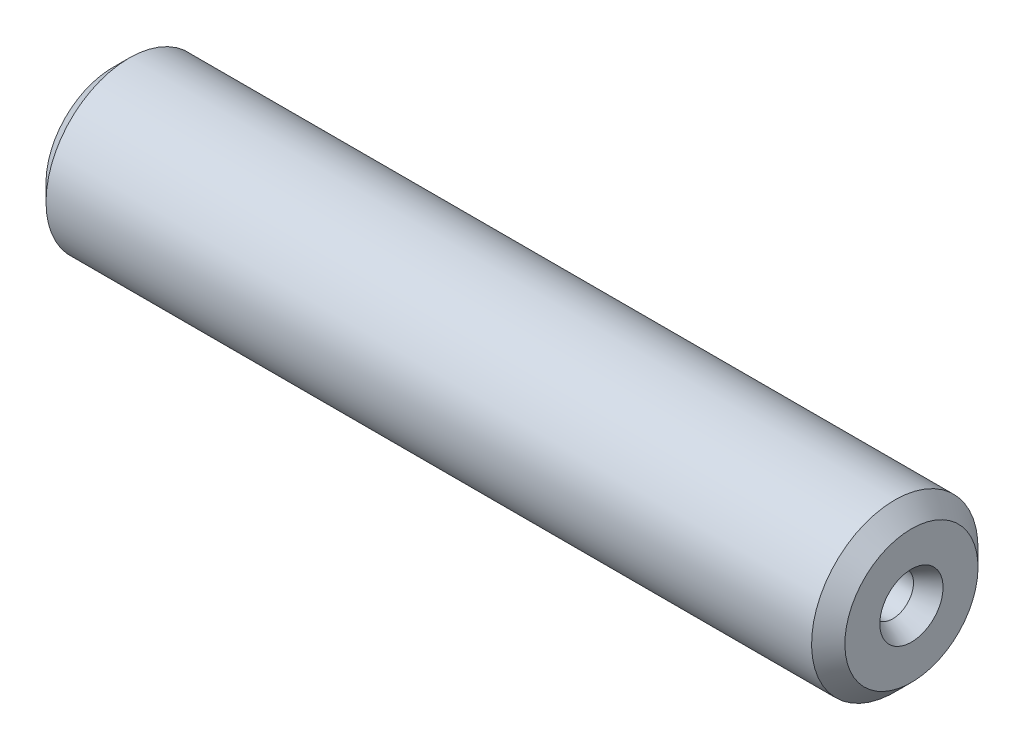
ISO-10303-21;
HEADER;
FILE_DESCRIPTION(('STEP AP214'),'2;1');
FILE_NAME('part.step','',(''),(''),'','','');
FILE_SCHEMA(('AUTOMOTIVE_DESIGN { 1 0 10303 214 1 1 1 1 }'));
ENDSEC;
DATA;
#1=APPLICATION_CONTEXT('core data for automotive mechanical design processes');
#2=APPLICATION_PROTOCOL_DEFINITION('international standard','automotive_design',2000,#1);
#3=PRODUCT_CONTEXT('',#1,'mechanical');
#4=PRODUCT('Part','Part','',(#3));
#5=PRODUCT_RELATED_PRODUCT_CATEGORY('part','',(#4));
#6=PRODUCT_DEFINITION_FORMATION('','',#4);
#7=PRODUCT_DEFINITION_CONTEXT('part definition',#1,'design');
#8=PRODUCT_DEFINITION('design','',#6,#7);
#9=PRODUCT_DEFINITION_SHAPE('','',#8);
#10=(LENGTH_UNIT() NAMED_UNIT(*) SI_UNIT(.MILLI.,.METRE.));
#11=(NAMED_UNIT(*) PLANE_ANGLE_UNIT() SI_UNIT($,.RADIAN.));
#12=(NAMED_UNIT(*) SI_UNIT($,.STERADIAN.) SOLID_ANGLE_UNIT());
#13=UNCERTAINTY_MEASURE_WITH_UNIT(LENGTH_MEASURE(1.E-05),#10,'distance_accuracy_value','');
#14=(GEOMETRIC_REPRESENTATION_CONTEXT(3) GLOBAL_UNCERTAINTY_ASSIGNED_CONTEXT((#13)) GLOBAL_UNIT_ASSIGNED_CONTEXT((#10,
#11,#12)) REPRESENTATION_CONTEXT('',''));
#15=CARTESIAN_POINT('',(0.,0.,0.));
#16=DIRECTION('',(0.,0.,1.));
#17=DIRECTION('',(1.,0.,0.));
#18=AXIS2_PLACEMENT_3D('',#15,#16,#17);
#19=CARTESIAN_POINT('',(0.,0.,0.));
#20=DIRECTION('',(1.,0.,0.));
#21=DIRECTION('',(0.,1.,0.));
#22=AXIS2_PLACEMENT_3D('',#19,#20,#21);
#23=CYLINDRICAL_SURFACE('',#22,5.);
#24=CARTESIAN_POINT('',(-47.,0.,0.));
#25=DIRECTION('',(-1.,0.,0.));
#26=DIRECTION('',(0.,-1.,0.));
#27=AXIS2_PLACEMENT_3D('',#24,#25,#26);
#28=CIRCLE('',#27,5.);
#29=CARTESIAN_POINT('',(-47.,-4.99999999999994,0.));
#30=VERTEX_POINT('',#29);
#31=EDGE_CURVE('E98',#30,#30,#28,.F.);
#32=ORIENTED_EDGE('',*,*,#31,.T.);
#33=EDGE_LOOP('',(#32));
#34=FACE_BOUND('',#33,.T.);
#35=CARTESIAN_POINT('',(-1.,0.,0.));
#36=DIRECTION('',(1.,0.,0.));
#37=DIRECTION('',(0.,1.,0.));
#38=AXIS2_PLACEMENT_3D('',#35,#36,#37);
#39=CIRCLE('',#38,5.);
#40=CARTESIAN_POINT('',(-1.,5.,0.));
#41=VERTEX_POINT('',#40);
#42=EDGE_CURVE('E99',#41,#41,#39,.F.);
#43=ORIENTED_EDGE('',*,*,#42,.T.);
#44=EDGE_LOOP('',(#43));
#45=FACE_BOUND('',#44,.T.);
#46=ADVANCED_FACE('F50',(#34,#45),#23,.T.);
#47=CARTESIAN_POINT('',(-48.,4.99999999999986,0.));
#48=DIRECTION('',(-1.,0.,0.));
#49=DIRECTION('',(0.,-1.,0.));
#50=AXIS2_PLACEMENT_3D('',#47,#48,#49);
#51=PLANE('',#50);
#52=CARTESIAN_POINT('',(-48.,0.,0.));
#53=DIRECTION('',(-1.,0.,0.));
#54=DIRECTION('',(0.,-1.,0.));
#55=AXIS2_PLACEMENT_3D('',#52,#53,#54);
#56=CIRCLE('',#55,4.);
#57=CARTESIAN_POINT('',(-48.,-3.99999999999994,0.));
#58=VERTEX_POINT('',#57);
#59=EDGE_CURVE('E57',#58,#58,#56,.T.);
#60=ORIENTED_EDGE('',*,*,#59,.T.);
#61=EDGE_LOOP('',(#60));
#62=FACE_BOUND('',#61,.T.);
#63=ADVANCED_FACE('F63',(#62),#51,.T.);
#64=CARTESIAN_POINT('',(-4.,0.,0.));
#65=DIRECTION('',(1.,0.,0.));
#66=DIRECTION('',(0.,1.,0.));
#67=AXIS2_PLACEMENT_3D('',#64,#65,#66);
#68=CONICAL_SURFACE('',#67,0.,1.02974425867666);
#69=CARTESIAN_POINT('',(-3.24892422621553,0.,0.));
#70=DIRECTION('',(1.,0.,0.));
#71=DIRECTION('',(0.,1.,0.));
#72=AXIS2_PLACEMENT_3D('',#69,#70,#71);
#73=CIRCLE('',#72,1.25);
#74=CARTESIAN_POINT('',(-3.24892422621553,1.25,0.));
#75=VERTEX_POINT('',#74);
#76=EDGE_CURVE('E102',#75,#75,#73,.T.);
#77=ORIENTED_EDGE('',*,*,#76,.T.);
#78=EDGE_LOOP('',(#77));
#79=FACE_BOUND('',#78,.T.);
#80=CARTESIAN_POINT('',(-4.,0.,0.));
#81=VERTEX_POINT('',#80);
#82=VERTEX_LOOP('',#81);
#83=FACE_BOUND('',#82,.T.);
#84=ADVANCED_FACE('F60',(#79,#83),#68,.F.);
#85=CARTESIAN_POINT('',(0.,0.,0.));
#86=DIRECTION('',(1.,0.,0.));
#87=DIRECTION('',(0.,1.,0.));
#88=AXIS2_PLACEMENT_3D('',#85,#86,#87);
#89=CYLINDRICAL_SURFACE('',#88,1.25);
#90=CARTESIAN_POINT('',(-1.12583302491975,0.,0.));
#91=DIRECTION('',(1.,0.,0.));
#92=DIRECTION('',(0.,1.,0.));
#93=AXIS2_PLACEMENT_3D('',#90,#91,#92);
#94=CIRCLE('',#93,1.25);
#95=CARTESIAN_POINT('',(-1.12583302491975,1.25,0.));
#96=VERTEX_POINT('',#95);
#97=EDGE_CURVE('E106',#96,#96,#94,.T.);
#98=ORIENTED_EDGE('',*,*,#97,.T.);
#99=EDGE_LOOP('',(#98));
#100=FACE_BOUND('',#99,.T.);
#101=ORIENTED_EDGE('',*,*,#76,.F.);
#102=EDGE_LOOP('',(#101));
#103=FACE_BOUND('',#102,.T.);
#104=ADVANCED_FACE('F62',(#100,#103),#89,.F.);
#105=CARTESIAN_POINT('',(-1.12583302491975,0.,0.));
#106=DIRECTION('',(1.,0.,0.));
#107=DIRECTION('',(0.,1.,0.));
#108=AXIS2_PLACEMENT_3D('',#105,#106,#107);
#109=CONICAL_SURFACE('',#108,1.25,0.5235987755983);
#110=CARTESIAN_POINT('',(0.,0.,0.));
#111=DIRECTION('',(1.,0.,0.));
#112=DIRECTION('',(0.,1.,0.));
#113=AXIS2_PLACEMENT_3D('',#110,#111,#112);
#114=CIRCLE('',#113,1.9);
#115=CARTESIAN_POINT('',(0.,1.9,0.));
#116=VERTEX_POINT('',#115);
#117=EDGE_CURVE('E109',#116,#116,#114,.T.);
#118=ORIENTED_EDGE('',*,*,#117,.T.);
#119=EDGE_LOOP('',(#118));
#120=FACE_BOUND('',#119,.T.);
#121=ORIENTED_EDGE('',*,*,#97,.F.);
#122=EDGE_LOOP('',(#121));
#123=FACE_BOUND('',#122,.T.);
#124=ADVANCED_FACE('F70',(#120,#123),#109,.F.);
#125=CARTESIAN_POINT('',(0.,1.90000000000019,0.));
#126=DIRECTION('',(1.,0.,0.));
#127=DIRECTION('',(0.,1.,0.));
#128=AXIS2_PLACEMENT_3D('',#125,#126,#127);
#129=PLANE('',#128);
#130=CARTESIAN_POINT('',(0.,0.,0.));
#131=DIRECTION('',(1.,0.,0.));
#132=DIRECTION('',(0.,1.,0.));
#133=AXIS2_PLACEMENT_3D('',#130,#131,#132);
#134=CIRCLE('',#133,4.);
#135=CARTESIAN_POINT('',(0.,4.,0.));
#136=VERTEX_POINT('',#135);
#137=EDGE_CURVE('E11',#136,#136,#134,.T.);
#138=ORIENTED_EDGE('',*,*,#137,.T.);
#139=EDGE_LOOP('',(#138));
#140=FACE_BOUND('',#139,.T.);
#141=ORIENTED_EDGE('',*,*,#117,.F.);
#142=EDGE_LOOP('',(#141));
#143=FACE_BOUND('',#142,.T.);
#144=ADVANCED_FACE('F85',(#140,#143),#129,.T.);
#145=CARTESIAN_POINT('',(-47.,0.,0.));
#146=DIRECTION('',(1.,0.,0.));
#147=DIRECTION('',(0.,1.,0.));
#148=AXIS2_PLACEMENT_3D('',#145,#146,#147);
#149=CONICAL_SURFACE('',#148,5.,0.785398163397446);
#150=ORIENTED_EDGE('',*,*,#59,.F.);
#151=EDGE_LOOP('',(#150));
#152=FACE_BOUND('',#151,.T.);
#153=ORIENTED_EDGE('',*,*,#31,.F.);
#154=EDGE_LOOP('',(#153));
#155=FACE_BOUND('',#154,.T.);
#156=ADVANCED_FACE('F83',(#152,#155),#149,.T.);
#157=CARTESIAN_POINT('',(0.,0.,0.));
#158=DIRECTION('',(-1.,0.,0.));
#159=DIRECTION('',(0.,-1.,0.));
#160=AXIS2_PLACEMENT_3D('',#157,#158,#159);
#161=CONICAL_SURFACE('',#160,4.,0.785398163397447);
#162=ORIENTED_EDGE('',*,*,#42,.F.);
#163=EDGE_LOOP('',(#162));
#164=FACE_BOUND('',#163,.T.);
#165=ORIENTED_EDGE('',*,*,#137,.F.);
#166=EDGE_LOOP('',(#165));
#167=FACE_BOUND('',#166,.T.);
#168=ADVANCED_FACE('F52',(#164,#167),#161,.T.);
#169=CLOSED_SHELL('',(#46,#63,#84,#104,#124,#144,#156,#168));
#170=MANIFOLD_SOLID_BREP('B2',#169);
#171=ADVANCED_BREP_SHAPE_REPRESENTATION('',(#18,#170),#14);
#172=SHAPE_DEFINITION_REPRESENTATION(#9,#171);
ENDSEC;
END-ISO-10303-21;
